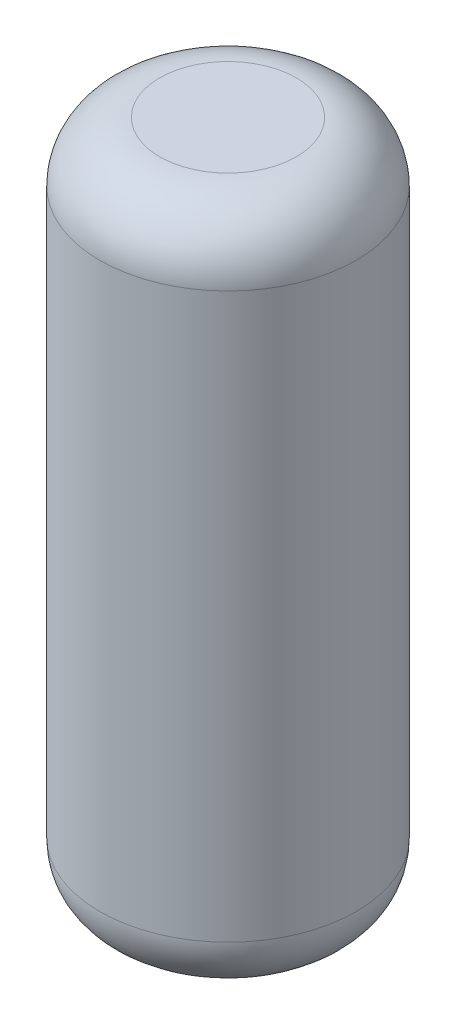
ISO-10303-21;
HEADER;
FILE_DESCRIPTION(('STEP AP214'),'2;1');
FILE_NAME('part.step','',(''),(''),'','','');
FILE_SCHEMA(('AUTOMOTIVE_DESIGN { 1 0 10303 214 1 1 1 1 }'));
ENDSEC;
DATA;
#1=APPLICATION_CONTEXT('core data for automotive mechanical design processes');
#2=APPLICATION_PROTOCOL_DEFINITION('international standard','automotive_design',2000,#1);
#3=PRODUCT_CONTEXT('',#1,'mechanical');
#4=PRODUCT('Part','Part','',(#3));
#5=PRODUCT_RELATED_PRODUCT_CATEGORY('part','',(#4));
#6=PRODUCT_DEFINITION_FORMATION('','',#4);
#7=PRODUCT_DEFINITION_CONTEXT('part definition',#1,'design');
#8=PRODUCT_DEFINITION('design','',#6,#7);
#9=PRODUCT_DEFINITION_SHAPE('','',#8);
#10=(LENGTH_UNIT() NAMED_UNIT(*) SI_UNIT(.MILLI.,.METRE.));
#11=(NAMED_UNIT(*) PLANE_ANGLE_UNIT() SI_UNIT($,.RADIAN.));
#12=(NAMED_UNIT(*) SI_UNIT($,.STERADIAN.) SOLID_ANGLE_UNIT());
#13=UNCERTAINTY_MEASURE_WITH_UNIT(LENGTH_MEASURE(1.E-05),#10,'distance_accuracy_value','');
#14=(GEOMETRIC_REPRESENTATION_CONTEXT(3) GLOBAL_UNCERTAINTY_ASSIGNED_CONTEXT((#13)) GLOBAL_UNIT_ASSIGNED_CONTEXT((#10,
#11,#12)) REPRESENTATION_CONTEXT('',''));
#15=CARTESIAN_POINT('',(0.,0.,0.));
#16=DIRECTION('',(0.,0.,1.));
#17=DIRECTION('',(1.,0.,0.));
#18=AXIS2_PLACEMENT_3D('',#15,#16,#17);
#19=CARTESIAN_POINT('',(0.,3616.12894278672,0.));
#20=DIRECTION('',(0.,-1.,0.));
#21=DIRECTION('',(0.,0.,-1.));
#22=AXIS2_PLACEMENT_3D('',#19,#20,#21);
#23=PLANE('',#22);
#24=CARTESIAN_POINT('',(0.,3616.12894278672,0.));
#25=DIRECTION('',(0.,-1.,0.));
#26=DIRECTION('',(0.,0.,-1.));
#27=AXIS2_PLACEMENT_3D('',#24,#25,#26);
#28=CIRCLE('',#27,400.);
#29=CARTESIAN_POINT('',(0.,3616.12894278672,-400.));
#30=VERTEX_POINT('',#29);
#31=EDGE_CURVE('E10',#30,#30,#28,.T.);
#32=ORIENTED_EDGE('',*,*,#31,.F.);
#33=EDGE_LOOP('',(#32));
#34=FACE_BOUND('',#33,.T.);
#35=ADVANCED_FACE('F38',(#34),#23,.F.);
#36=CARTESIAN_POINT('',(0.,3266.12894278672,0.));
#37=DIRECTION('',(0.,-1.,0.));
#38=DIRECTION('',(0.,0.,-1.));
#39=AXIS2_PLACEMENT_3D('',#36,#37,#38);
#40=TOROIDAL_SURFACE('',#39,400.,350.);
#41=CARTESIAN_POINT('',(0.,3266.12894278672,0.));
#42=DIRECTION('',(0.,-1.,0.));
#43=DIRECTION('',(0.,0.,-1.));
#44=AXIS2_PLACEMENT_3D('',#41,#42,#43);
#45=CIRCLE('',#44,750.);
#46=CARTESIAN_POINT('',(0.,3266.12894278672,-750.));
#47=VERTEX_POINT('',#46);
#48=EDGE_CURVE('E46',#47,#47,#45,.T.);
#49=ORIENTED_EDGE('',*,*,#48,.F.);
#50=EDGE_LOOP('',(#49));
#51=FACE_BOUND('',#50,.T.);
#52=ORIENTED_EDGE('',*,*,#31,.T.);
#53=EDGE_LOOP('',(#52));
#54=FACE_BOUND('',#53,.T.);
#55=ADVANCED_FACE('F116',(#51,#54),#40,.T.);
#56=CARTESIAN_POINT('',(0.,0.,0.));
#57=DIRECTION('',(0.,-1.,0.));
#58=DIRECTION('',(0.,0.,-1.));
#59=AXIS2_PLACEMENT_3D('',#56,#57,#58);
#60=CYLINDRICAL_SURFACE('',#59,750.);
#61=CARTESIAN_POINT('',(0.,-33.8710572132792,0.));
#62=DIRECTION('',(0.,-1.,0.));
#63=DIRECTION('',(0.,0.,-1.));
#64=AXIS2_PLACEMENT_3D('',#61,#62,#63);
#65=CIRCLE('',#64,750.);
#66=CARTESIAN_POINT('',(0.,-33.8710572132792,-750.));
#67=VERTEX_POINT('',#66);
#68=EDGE_CURVE('E51',#67,#67,#65,.T.);
#69=ORIENTED_EDGE('',*,*,#68,.F.);
#70=EDGE_LOOP('',(#69));
#71=FACE_BOUND('',#70,.T.);
#72=ORIENTED_EDGE('',*,*,#48,.T.);
#73=EDGE_LOOP('',(#72));
#74=FACE_BOUND('',#73,.T.);
#75=ADVANCED_FACE('F113',(#71,#74),#60,.T.);
#76=CARTESIAN_POINT('',(0.,-33.8710572132792,0.));
#77=DIRECTION('',(0.,-1.,0.));
#78=DIRECTION('',(0.,0.,-1.));
#79=AXIS2_PLACEMENT_3D('',#76,#77,#78);
#80=TOROIDAL_SURFACE('',#79,399.999999999999,350.);
#81=CARTESIAN_POINT('',(0.,-383.871057213279,0.));
#82=DIRECTION('',(0.,-1.,0.));
#83=DIRECTION('',(0.,0.,-1.));
#84=AXIS2_PLACEMENT_3D('',#81,#82,#83);
#85=CIRCLE('',#84,400.);
#86=CARTESIAN_POINT('',(0.,-383.871057213279,-400.));
#87=VERTEX_POINT('',#86);
#88=EDGE_CURVE('E56',#87,#87,#85,.T.);
#89=ORIENTED_EDGE('',*,*,#88,.F.);
#90=EDGE_LOOP('',(#89));
#91=FACE_BOUND('',#90,.T.);
#92=ORIENTED_EDGE('',*,*,#68,.T.);
#93=EDGE_LOOP('',(#92));
#94=FACE_BOUND('',#93,.T.);
#95=ADVANCED_FACE('F109',(#91,#94),#80,.T.);
#96=CARTESIAN_POINT('',(-400.,-383.871057213279,0.));
#97=DIRECTION('',(0.,1.,0.));
#98=DIRECTION('',(0.,0.,1.));
#99=AXIS2_PLACEMENT_3D('',#96,#97,#98);
#100=PLANE('',#99);
#101=ORIENTED_EDGE('',*,*,#88,.T.);
#102=EDGE_LOOP('',(#101));
#103=FACE_BOUND('',#102,.T.);
#104=ADVANCED_FACE('F107',(#103),#100,.F.);
#105=CLOSED_SHELL('',(#35,#55,#75,#95,#104));
#106=CARTESIAN_POINT('',(0.,-283.871057213279,0.));
#107=DIRECTION('',(0.,-1.,0.));
#108=DIRECTION('',(0.,0.,-1.));
#109=AXIS2_PLACEMENT_3D('',#106,#107,#108);
#110=PLANE('',#109);
#111=CARTESIAN_POINT('',(0.,-283.871057213279,0.));
#112=DIRECTION('',(0.,-1.,0.));
#113=DIRECTION('',(0.,0.,-1.));
#114=AXIS2_PLACEMENT_3D('',#111,#112,#113);
#115=CIRCLE('',#114,50.);
#116=CARTESIAN_POINT('',(0.,-283.871057213279,-50.));
#117=VERTEX_POINT('',#116);
#118=EDGE_CURVE('E62',#117,#117,#115,.T.);
#119=ORIENTED_EDGE('',*,*,#118,.F.);
#120=EDGE_LOOP('',(#119));
#121=FACE_BOUND('',#120,.T.);
#122=ADVANCED_FACE('F97',(#121),#110,.F.);
#123=CARTESIAN_POINT('',(0.,66.1289427867207,0.));
#124=DIRECTION('',(0.,-1.,0.));
#125=DIRECTION('',(0.,0.,-1.));
#126=AXIS2_PLACEMENT_3D('',#123,#124,#125);
#127=DEGENERATE_TOROIDAL_SURFACE('',#126,50.,350.,.T.);
#128=CARTESIAN_POINT('',(0.,66.1289427867207,0.));
#129=DIRECTION('',(0.,-1.,0.));
#130=DIRECTION('',(0.,0.,-1.));
#131=AXIS2_PLACEMENT_3D('',#128,#129,#130);
#132=CIRCLE('',#131,400.);
#133=CARTESIAN_POINT('',(0.,66.1289427867207,-400.));
#134=VERTEX_POINT('',#133);
#135=EDGE_CURVE('E66',#134,#134,#132,.T.);
#136=ORIENTED_EDGE('',*,*,#135,.F.);
#137=EDGE_LOOP('',(#136));
#138=FACE_BOUND('',#137,.T.);
#139=ORIENTED_EDGE('',*,*,#118,.T.);
#140=EDGE_LOOP('',(#139));
#141=FACE_BOUND('',#140,.T.);
#142=ADVANCED_FACE('F91',(#138,#141),#127,.F.);
#143=CARTESIAN_POINT('',(0.,0.,0.));
#144=DIRECTION('',(0.,-1.,0.));
#145=DIRECTION('',(0.,0.,-1.));
#146=AXIS2_PLACEMENT_3D('',#143,#144,#145);
#147=CYLINDRICAL_SURFACE('',#146,400.);
#148=CARTESIAN_POINT('',(0.,3166.12894278672,0.));
#149=DIRECTION('',(0.,-1.,0.));
#150=DIRECTION('',(0.,0.,-1.));
#151=AXIS2_PLACEMENT_3D('',#148,#149,#150);
#152=CIRCLE('',#151,400.);
#153=CARTESIAN_POINT('',(0.,3166.12894278672,-400.));
#154=VERTEX_POINT('',#153);
#155=EDGE_CURVE('E70',#154,#154,#152,.T.);
#156=ORIENTED_EDGE('',*,*,#155,.F.);
#157=EDGE_LOOP('',(#156));
#158=FACE_BOUND('',#157,.T.);
#159=ORIENTED_EDGE('',*,*,#135,.T.);
#160=EDGE_LOOP('',(#159));
#161=FACE_BOUND('',#160,.T.);
#162=ADVANCED_FACE('F84',(#158,#161),#147,.F.);
#163=CARTESIAN_POINT('',(0.,3166.12894278672,0.));
#164=DIRECTION('',(0.,-1.,0.));
#165=DIRECTION('',(0.,0.,-1.));
#166=AXIS2_PLACEMENT_3D('',#163,#164,#165);
#167=DEGENERATE_TOROIDAL_SURFACE('',#166,50.,350.,.T.);
#168=CARTESIAN_POINT('',(0.,3516.12894278672,0.));
#169=DIRECTION('',(0.,-1.,0.));
#170=DIRECTION('',(0.,0.,-1.));
#171=AXIS2_PLACEMENT_3D('',#168,#169,#170);
#172=CIRCLE('',#171,50.0000000000001);
#173=CARTESIAN_POINT('',(0.,3516.12894278672,-50.0000000000001));
#174=VERTEX_POINT('',#173);
#175=EDGE_CURVE('E74',#174,#174,#172,.T.);
#176=ORIENTED_EDGE('',*,*,#175,.F.);
#177=EDGE_LOOP('',(#176));
#178=FACE_BOUND('',#177,.T.);
#179=ORIENTED_EDGE('',*,*,#155,.T.);
#180=EDGE_LOOP('',(#179));
#181=FACE_BOUND('',#180,.T.);
#182=ADVANCED_FACE('F81',(#178,#181),#167,.F.);
#183=CARTESIAN_POINT('',(-50.0000000000001,3516.12894278672,0.));
#184=DIRECTION('',(0.,1.,0.));
#185=DIRECTION('',(0.,0.,1.));
#186=AXIS2_PLACEMENT_3D('',#183,#184,#185);
#187=PLANE('',#186);
#188=ORIENTED_EDGE('',*,*,#175,.T.);
#189=EDGE_LOOP('',(#188));
#190=FACE_BOUND('',#189,.T.);
#191=ADVANCED_FACE('F79',(#190),#187,.F.);
#192=CLOSED_SHELL('',(#122,#142,#162,#182,#191));
#193=ORIENTED_CLOSED_SHELL('',*,#192,.T.);
#194=BREP_WITH_VOIDS('B2',#105,(#193));
#195=ADVANCED_BREP_SHAPE_REPRESENTATION('',(#18,#194),#14);
#196=SHAPE_DEFINITION_REPRESENTATION(#9,#195);
ENDSEC;
END-ISO-10303-21;
